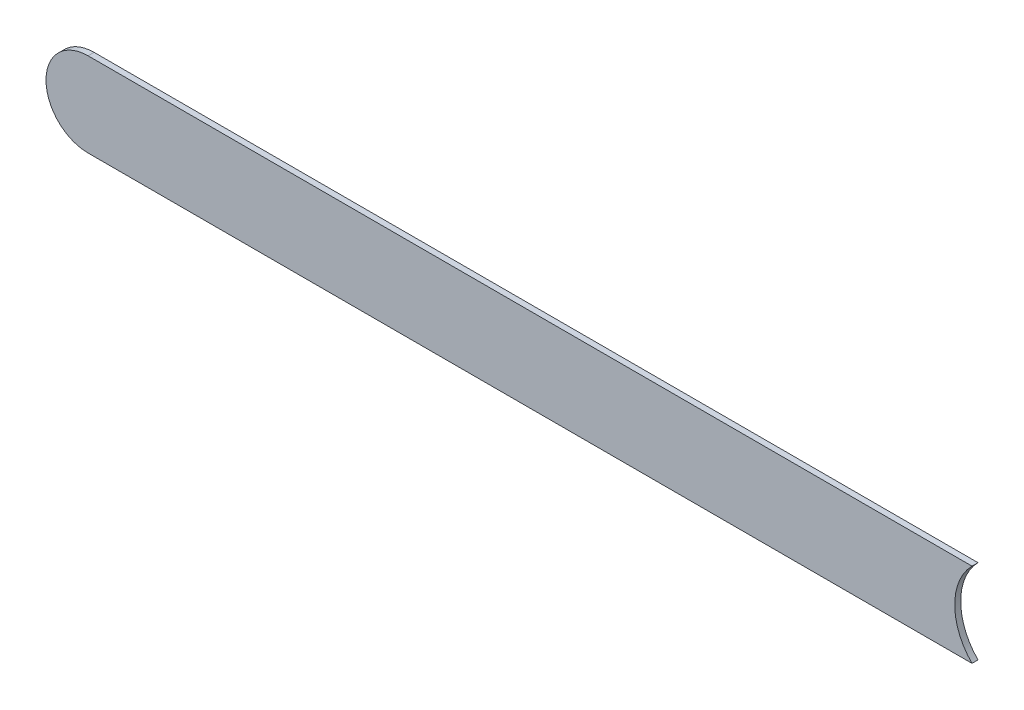
ISO-10303-21;
HEADER;
FILE_DESCRIPTION(('STEP AP214'),'2;1');
FILE_NAME('part.step','',(''),(''),'','','');
FILE_SCHEMA(('AUTOMOTIVE_DESIGN { 1 0 10303 214 1 1 1 1 }'));
ENDSEC;
DATA;
#1=APPLICATION_CONTEXT('core data for automotive mechanical design processes');
#2=APPLICATION_PROTOCOL_DEFINITION('international standard','automotive_design',2000,#1);
#3=PRODUCT_CONTEXT('',#1,'mechanical');
#4=PRODUCT('Part','Part','',(#3));
#5=PRODUCT_RELATED_PRODUCT_CATEGORY('part','',(#4));
#6=PRODUCT_DEFINITION_FORMATION('','',#4);
#7=PRODUCT_DEFINITION_CONTEXT('part definition',#1,'design');
#8=PRODUCT_DEFINITION('design','',#6,#7);
#9=PRODUCT_DEFINITION_SHAPE('','',#8);
#10=(LENGTH_UNIT() NAMED_UNIT(*) SI_UNIT(.MILLI.,.METRE.));
#11=(NAMED_UNIT(*) PLANE_ANGLE_UNIT() SI_UNIT($,.RADIAN.));
#12=(NAMED_UNIT(*) SI_UNIT($,.STERADIAN.) SOLID_ANGLE_UNIT());
#13=UNCERTAINTY_MEASURE_WITH_UNIT(LENGTH_MEASURE(1.E-05),#10,'distance_accuracy_value','');
#14=(GEOMETRIC_REPRESENTATION_CONTEXT(3) GLOBAL_UNCERTAINTY_ASSIGNED_CONTEXT((#13)) GLOBAL_UNIT_ASSIGNED_CONTEXT((#10,
#11,#12)) REPRESENTATION_CONTEXT('',''));
#15=CARTESIAN_POINT('',(0.,0.,0.));
#16=DIRECTION('',(0.,0.,1.));
#17=DIRECTION('',(1.,0.,0.));
#18=AXIS2_PLACEMENT_3D('',#15,#16,#17);
#19=CARTESIAN_POINT('',(39.90000148,104.24999978,0.));
#20=DIRECTION('',(0.,1.,0.));
#21=DIRECTION('',(1.,0.,0.));
#22=AXIS2_PLACEMENT_3D('',#19,#20,#21);
#23=PLANE('',#22);
#24=DIRECTION('',(1.,0.,0.));
#25=VECTOR('',#24,1.);
#26=CARTESIAN_POINT('',(39.90000148,104.24999978,0.03556));
#27=LINE('',#26,#25);
#28=CARTESIAN_POINT('',(39.90000148,104.24999978,0.03556));
#29=VERTEX_POINT('',#28);
#30=CARTESIAN_POINT('',(45.1471140844069,104.24999978,0.03556));
#31=VERTEX_POINT('',#30);
#32=EDGE_CURVE('E11',#29,#31,#27,.T.);
#33=ORIENTED_EDGE('',*,*,#32,.F.);
#34=DIRECTION('',(0.,0.,1.));
#35=VECTOR('',#34,1.);
#36=CARTESIAN_POINT('',(39.90000148,104.24999978,0.));
#37=LINE('',#36,#35);
#38=CARTESIAN_POINT('',(39.90000148,104.24999978,0.));
#39=VERTEX_POINT('',#38);
#40=EDGE_CURVE('E24',#39,#29,#37,.T.);
#41=ORIENTED_EDGE('',*,*,#40,.F.);
#42=DIRECTION('',(1.,0.,0.));
#43=VECTOR('',#42,1.);
#44=CARTESIAN_POINT('',(39.90000148,104.24999978,0.));
#45=LINE('',#44,#43);
#46=CARTESIAN_POINT('',(45.1471140844069,104.24999978,0.));
#47=VERTEX_POINT('',#46);
#48=EDGE_CURVE('E75',#39,#47,#45,.T.);
#49=ORIENTED_EDGE('',*,*,#48,.T.);
#50=DIRECTION('',(0.,0.,1.));
#51=VECTOR('',#50,1.);
#52=CARTESIAN_POINT('',(45.1471140844069,104.24999978,0.));
#53=LINE('',#52,#51);
#54=EDGE_CURVE('E37',#47,#31,#53,.T.);
#55=ORIENTED_EDGE('',*,*,#54,.T.);
#56=EDGE_LOOP('',(#33,#41,#49,#55));
#57=FACE_BOUND('',#56,.T.);
#58=ADVANCED_FACE('F17',(#57),#23,.F.);
#59=CARTESIAN_POINT('',(45.40000064,104.49999928,0.));
#60=DIRECTION('',(0.,0.,-1.));
#61=DIRECTION('',(1.,0.,0.));
#62=AXIS2_PLACEMENT_3D('',#59,#60,#61);
#63=CYLINDRICAL_SURFACE('',#62,0.3556);
#64=DIRECTION('',(0.,0.,1.));
#65=VECTOR('',#64,1.);
#66=CARTESIAN_POINT('',(45.1471140844069,104.74999878,0.));
#67=LINE('',#66,#65);
#68=CARTESIAN_POINT('',(45.1471140844069,104.74999878,0.));
#69=VERTEX_POINT('',#68);
#70=CARTESIAN_POINT('',(45.1471140844069,104.74999878,0.03556));
#71=VERTEX_POINT('',#70);
#72=EDGE_CURVE('E67',#69,#71,#67,.T.);
#73=ORIENTED_EDGE('',*,*,#72,.T.);
#74=CARTESIAN_POINT('',(45.40000064,104.49999928,0.03556));
#75=DIRECTION('',(0.,0.,1.));
#76=DIRECTION('',(1.,0.,0.));
#77=AXIS2_PLACEMENT_3D('',#74,#75,#76);
#78=CIRCLE('',#77,0.3556);
#79=EDGE_CURVE('E82',#71,#31,#78,.T.);
#80=ORIENTED_EDGE('',*,*,#79,.T.);
#81=ORIENTED_EDGE('',*,*,#54,.F.);
#82=CARTESIAN_POINT('',(45.40000064,104.49999928,0.));
#83=DIRECTION('',(0.,0.,1.));
#84=DIRECTION('',(1.,0.,0.));
#85=AXIS2_PLACEMENT_3D('',#82,#83,#84);
#86=CIRCLE('',#85,0.3556);
#87=EDGE_CURVE('E80',#69,#47,#86,.T.);
#88=ORIENTED_EDGE('',*,*,#87,.F.);
#89=EDGE_LOOP('',(#73,#80,#81,#88));
#90=FACE_BOUND('',#89,.T.);
#91=ADVANCED_FACE('F88',(#90),#63,.F.);
#92=CARTESIAN_POINT('',(45.1471140844069,104.74999878,0.));
#93=DIRECTION('',(0.,-1.,0.));
#94=DIRECTION('',(-1.,0.,0.));
#95=AXIS2_PLACEMENT_3D('',#92,#93,#94);
#96=PLANE('',#95);
#97=DIRECTION('',(-1.,0.,0.));
#98=VECTOR('',#97,1.);
#99=CARTESIAN_POINT('',(45.40000064,104.74999878,0.03556));
#100=LINE('',#99,#98);
#101=CARTESIAN_POINT('',(39.90000148,104.74999878,0.03556));
#102=VERTEX_POINT('',#101);
#103=EDGE_CURVE('E71',#71,#102,#100,.T.);
#104=ORIENTED_EDGE('',*,*,#103,.F.);
#105=ORIENTED_EDGE('',*,*,#72,.F.);
#106=DIRECTION('',(-1.,0.,0.));
#107=VECTOR('',#106,1.);
#108=CARTESIAN_POINT('',(45.40000064,104.74999878,0.));
#109=LINE('',#108,#107);
#110=CARTESIAN_POINT('',(39.90000148,104.74999878,0.));
#111=VERTEX_POINT('',#110);
#112=EDGE_CURVE('E63',#69,#111,#109,.T.);
#113=ORIENTED_EDGE('',*,*,#112,.T.);
#114=DIRECTION('',(0.,0.,1.));
#115=VECTOR('',#114,1.);
#116=CARTESIAN_POINT('',(39.90000148,104.74999878,0.));
#117=LINE('',#116,#115);
#118=EDGE_CURVE('E53',#111,#102,#117,.T.);
#119=ORIENTED_EDGE('',*,*,#118,.T.);
#120=EDGE_LOOP('',(#104,#105,#113,#119));
#121=FACE_BOUND('',#120,.T.);
#122=ADVANCED_FACE('F66',(#121),#96,.F.);
#123=CARTESIAN_POINT('',(39.90000148,104.49999928,0.));
#124=DIRECTION('',(0.,0.,-1.));
#125=DIRECTION('',(0.,1.,0.));
#126=AXIS2_PLACEMENT_3D('',#123,#124,#125);
#127=CYLINDRICAL_SURFACE('',#126,0.249999500000001);
#128=CARTESIAN_POINT('',(39.90000148,104.49999928,0.03556));
#129=DIRECTION('',(0.,0.,1.));
#130=DIRECTION('',(0.,1.,0.));
#131=AXIS2_PLACEMENT_3D('',#128,#129,#130);
#132=CIRCLE('',#131,0.249999500000001);
#133=EDGE_CURVE('E59',#102,#29,#132,.T.);
#134=ORIENTED_EDGE('',*,*,#133,.F.);
#135=ORIENTED_EDGE('',*,*,#118,.F.);
#136=CARTESIAN_POINT('',(39.90000148,104.49999928,0.));
#137=DIRECTION('',(0.,0.,1.));
#138=DIRECTION('',(0.,1.,0.));
#139=AXIS2_PLACEMENT_3D('',#136,#137,#138);
#140=CIRCLE('',#139,0.249999500000001);
#141=EDGE_CURVE('E57',#111,#39,#140,.T.);
#142=ORIENTED_EDGE('',*,*,#141,.T.);
#143=ORIENTED_EDGE('',*,*,#40,.T.);
#144=EDGE_LOOP('',(#134,#135,#142,#143));
#145=FACE_BOUND('',#144,.T.);
#146=ADVANCED_FACE('F55',(#145),#127,.T.);
#147=CARTESIAN_POINT('',(39.90000148,104.24999978,0.));
#148=DIRECTION('',(0.,0.,-1.));
#149=DIRECTION('',(-1.,0.,0.));
#150=AXIS2_PLACEMENT_3D('',#147,#148,#149);
#151=PLANE('',#150);
#152=ORIENTED_EDGE('',*,*,#48,.F.);
#153=ORIENTED_EDGE('',*,*,#141,.F.);
#154=ORIENTED_EDGE('',*,*,#112,.F.);
#155=ORIENTED_EDGE('',*,*,#87,.T.);
#156=EDGE_LOOP('',(#152,#153,#154,#155));
#157=FACE_BOUND('',#156,.T.);
#158=ADVANCED_FACE('F74',(#157),#151,.T.);
#159=CARTESIAN_POINT('',(39.90000148,104.24999978,0.03556));
#160=DIRECTION('',(0.,0.,-1.));
#161=DIRECTION('',(-1.,0.,0.));
#162=AXIS2_PLACEMENT_3D('',#159,#160,#161);
#163=PLANE('',#162);
#164=ORIENTED_EDGE('',*,*,#133,.T.);
#165=ORIENTED_EDGE('',*,*,#32,.T.);
#166=ORIENTED_EDGE('',*,*,#79,.F.);
#167=ORIENTED_EDGE('',*,*,#103,.T.);
#168=EDGE_LOOP('',(#164,#165,#166,#167));
#169=FACE_BOUND('',#168,.T.);
#170=ADVANCED_FACE('F91',(#169),#163,.F.);
#171=CLOSED_SHELL('',(#58,#91,#122,#146,#158,#170));
#172=MANIFOLD_SOLID_BREP('B1',#171);
#173=ADVANCED_BREP_SHAPE_REPRESENTATION('',(#18,#172),#14);
#174=SHAPE_DEFINITION_REPRESENTATION(#9,#173);
ENDSEC;
END-ISO-10303-21;
